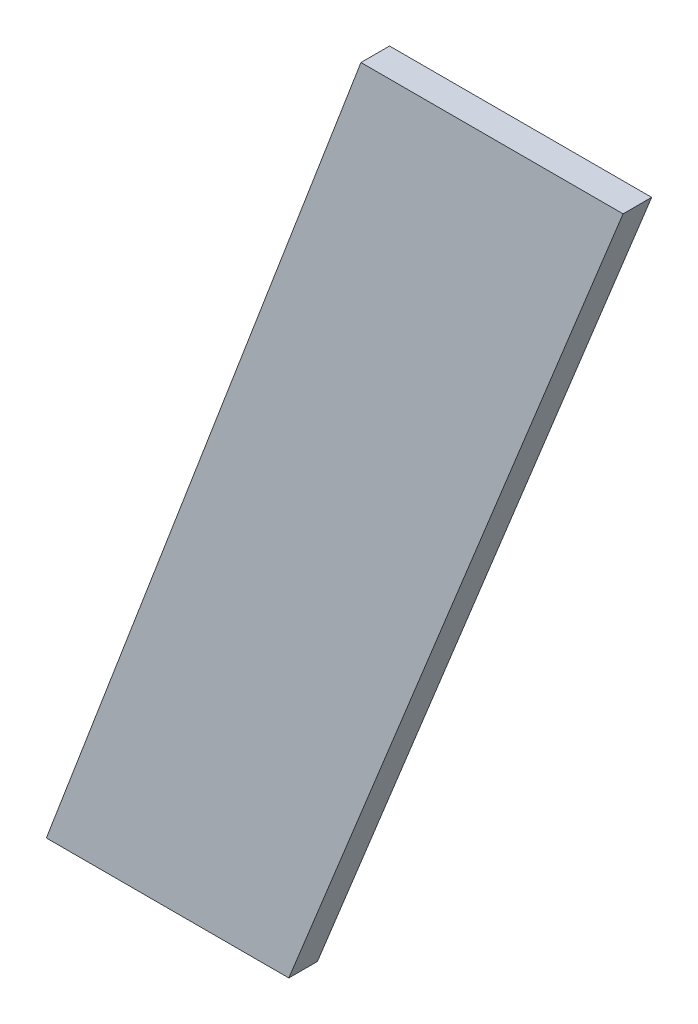
ISO-10303-21;
HEADER;
FILE_DESCRIPTION(('STEP AP214'),'2;1');
FILE_NAME('part.step','',(''),(''),'','','');
FILE_SCHEMA(('AUTOMOTIVE_DESIGN { 1 0 10303 214 1 1 1 1 }'));
ENDSEC;
DATA;
#1=APPLICATION_CONTEXT('core data for automotive mechanical design processes');
#2=APPLICATION_PROTOCOL_DEFINITION('international standard','automotive_design',2000,#1);
#3=PRODUCT_CONTEXT('',#1,'mechanical');
#4=PRODUCT('Part','Part','',(#3));
#5=PRODUCT_RELATED_PRODUCT_CATEGORY('part','',(#4));
#6=PRODUCT_DEFINITION_FORMATION('','',#4);
#7=PRODUCT_DEFINITION_CONTEXT('part definition',#1,'design');
#8=PRODUCT_DEFINITION('design','',#6,#7);
#9=PRODUCT_DEFINITION_SHAPE('','',#8);
#10=(LENGTH_UNIT() NAMED_UNIT(*) SI_UNIT(.MILLI.,.METRE.));
#11=(NAMED_UNIT(*) PLANE_ANGLE_UNIT() SI_UNIT($,.RADIAN.));
#12=(NAMED_UNIT(*) SI_UNIT($,.STERADIAN.) SOLID_ANGLE_UNIT());
#13=UNCERTAINTY_MEASURE_WITH_UNIT(LENGTH_MEASURE(1.E-05),#10,'distance_accuracy_value','');
#14=(GEOMETRIC_REPRESENTATION_CONTEXT(3) GLOBAL_UNCERTAINTY_ASSIGNED_CONTEXT((#13)) GLOBAL_UNIT_ASSIGNED_CONTEXT((#10,
#11,#12)) REPRESENTATION_CONTEXT('',''));
#15=CARTESIAN_POINT('',(0.,0.,0.));
#16=DIRECTION('',(0.,0.,1.));
#17=DIRECTION('',(1.,0.,0.));
#18=AXIS2_PLACEMENT_3D('',#15,#16,#17);
#19=CARTESIAN_POINT('',(14.2007211538462,15.,0.5));
#20=DIRECTION('',(0.,-1.,0.));
#21=DIRECTION('',(0.,0.,-1.));
#22=AXIS2_PLACEMENT_3D('',#19,#20,#21);
#23=PLANE('',#22);
#24=DIRECTION('',(-1.,0.,0.));
#25=VECTOR('',#24,1.);
#26=CARTESIAN_POINT('',(14.2007211538462,15.,0.));
#27=LINE('',#26,#25);
#28=CARTESIAN_POINT('',(14.2007211538462,15.,0.));
#29=VERTEX_POINT('',#28);
#30=CARTESIAN_POINT('',(9.61538461538463,15.,0.));
#31=VERTEX_POINT('',#30);
#32=EDGE_CURVE('E84',#29,#31,#27,.T.);
#33=ORIENTED_EDGE('',*,*,#32,.T.);
#34=DIRECTION('',(0.,0.,-1.));
#35=VECTOR('',#34,1.);
#36=CARTESIAN_POINT('',(9.61538461538463,15.,0.5));
#37=LINE('',#36,#35);
#38=CARTESIAN_POINT('',(9.61538461538463,15.,0.5));
#39=VERTEX_POINT('',#38);
#40=EDGE_CURVE('E90',#39,#31,#37,.T.);
#41=ORIENTED_EDGE('',*,*,#40,.F.);
#42=DIRECTION('',(-1.,0.,0.));
#43=VECTOR('',#42,1.);
#44=CARTESIAN_POINT('',(14.2007211538462,15.,0.5));
#45=LINE('',#44,#43);
#46=CARTESIAN_POINT('',(14.2007211538462,15.,0.5));
#47=VERTEX_POINT('',#46);
#48=EDGE_CURVE('E104',#47,#39,#45,.T.);
#49=ORIENTED_EDGE('',*,*,#48,.F.);
#50=DIRECTION('',(0.,0.,-1.));
#51=VECTOR('',#50,1.);
#52=CARTESIAN_POINT('',(14.2007211538462,15.,0.5));
#53=LINE('',#52,#51);
#54=EDGE_CURVE('E48',#47,#29,#53,.T.);
#55=ORIENTED_EDGE('',*,*,#54,.T.);
#56=EDGE_LOOP('',(#33,#41,#49,#55));
#57=FACE_BOUND('',#56,.T.);
#58=ADVANCED_FACE('F39',(#57),#23,.F.);
#59=CARTESIAN_POINT('',(0.579497032906944,-8.90680562357167,0.5));
#60=DIRECTION('',(0.,0.,-1.));
#61=DIRECTION('',(-1.,0.,0.));
#62=AXIS2_PLACEMENT_3D('',#59,#60,#61);
#63=PLANE('',#62);
#64=DIRECTION('',(-0.354843274387437,-0.934925799527429,0.));
#65=VECTOR('',#64,1.);
#66=CARTESIAN_POINT('',(9.61538461538463,15.,0.5));
#67=LINE('',#66,#65);
#68=CARTESIAN_POINT('',(4.11203078642991,0.5,0.5));
#69=VERTEX_POINT('',#68);
#70=EDGE_CURVE('E98',#39,#69,#67,.T.);
#71=ORIENTED_EDGE('',*,*,#70,.T.);
#72=DIRECTION('',(1.,0.,0.));
#73=VECTOR('',#72,1.);
#74=CARTESIAN_POINT('',(0.579497032906944,0.5,0.5));
#75=LINE('',#74,#73);
#76=CARTESIAN_POINT('',(8.35366586538463,0.5,0.5));
#77=VERTEX_POINT('',#76);
#78=EDGE_CURVE('E72',#69,#77,#75,.T.);
#79=ORIENTED_EDGE('',*,*,#78,.T.);
#80=DIRECTION('',(0.37398380014855,0.927435236135898,0.));
#81=VECTOR('',#80,1.);
#82=CARTESIAN_POINT('',(2.1033653846154,-15.,0.5));
#83=LINE('',#82,#81);
#84=EDGE_CURVE('E77',#77,#47,#83,.T.);
#85=ORIENTED_EDGE('',*,*,#84,.T.);
#86=ORIENTED_EDGE('',*,*,#48,.T.);
#87=EDGE_LOOP('',(#71,#79,#85,#86));
#88=FACE_BOUND('',#87,.T.);
#89=ADVANCED_FACE('F112',(#88),#63,.F.);
#90=CARTESIAN_POINT('',(9.61538461538463,15.,0.5));
#91=DIRECTION('',(0.934925799527429,-0.354843274387437,0.));
#92=DIRECTION('',(0.354843274387437,0.934925799527429,0.));
#93=AXIS2_PLACEMENT_3D('',#90,#91,#92);
#94=PLANE('',#93);
#95=DIRECTION('',(-0.354843274387437,-0.934925799527429,0.));
#96=VECTOR('',#95,1.);
#97=CARTESIAN_POINT('',(9.61538461538463,15.,0.));
#98=LINE('',#97,#96);
#99=CARTESIAN_POINT('',(4.11203078642991,0.5,0.));
#100=VERTEX_POINT('',#99);
#101=EDGE_CURVE('E95',#31,#100,#98,.T.);
#102=ORIENTED_EDGE('',*,*,#101,.T.);
#103=DIRECTION('',(0.,0.,1.));
#104=VECTOR('',#103,1.);
#105=CARTESIAN_POINT('',(4.11203078642991,0.5,0.5));
#106=LINE('',#105,#104);
#107=EDGE_CURVE('E67',#100,#69,#106,.T.);
#108=ORIENTED_EDGE('',*,*,#107,.T.);
#109=ORIENTED_EDGE('',*,*,#70,.F.);
#110=ORIENTED_EDGE('',*,*,#40,.T.);
#111=EDGE_LOOP('',(#102,#108,#109,#110));
#112=FACE_BOUND('',#111,.T.);
#113=ADVANCED_FACE('F100',(#112),#94,.F.);
#114=CARTESIAN_POINT('',(2.1033653846154,-15.,0.5));
#115=DIRECTION('',(-0.927435236135898,0.37398380014855,0.));
#116=DIRECTION('',(-0.37398380014855,-0.927435236135898,0.));
#117=AXIS2_PLACEMENT_3D('',#114,#115,#116);
#118=PLANE('',#117);
#119=ORIENTED_EDGE('',*,*,#84,.F.);
#120=DIRECTION('',(0.,0.,-1.));
#121=VECTOR('',#120,1.);
#122=CARTESIAN_POINT('',(8.35366586538463,0.5,0.5));
#123=LINE('',#122,#121);
#124=CARTESIAN_POINT('',(8.35366586538463,0.499999999999999,0.));
#125=VERTEX_POINT('',#124);
#126=EDGE_CURVE('E54',#77,#125,#123,.T.);
#127=ORIENTED_EDGE('',*,*,#126,.T.);
#128=DIRECTION('',(0.37398380014855,0.927435236135898,0.));
#129=VECTOR('',#128,1.);
#130=CARTESIAN_POINT('',(2.1033653846154,-15.,0.));
#131=LINE('',#130,#129);
#132=EDGE_CURVE('E93',#125,#29,#131,.T.);
#133=ORIENTED_EDGE('',*,*,#132,.T.);
#134=ORIENTED_EDGE('',*,*,#54,.F.);
#135=EDGE_LOOP('',(#119,#127,#133,#134));
#136=FACE_BOUND('',#135,.T.);
#137=ADVANCED_FACE('F41',(#136),#118,.F.);
#138=CARTESIAN_POINT('',(0.579497032906944,-8.90680562357167,0.));
#139=DIRECTION('',(0.,0.,-1.));
#140=DIRECTION('',(-1.,0.,0.));
#141=AXIS2_PLACEMENT_3D('',#138,#139,#140);
#142=PLANE('',#141);
#143=DIRECTION('',(1.,0.,0.));
#144=VECTOR('',#143,1.);
#145=CARTESIAN_POINT('',(0.579497032906944,0.5,0.));
#146=LINE('',#145,#144);
#147=EDGE_CURVE('E11',#100,#125,#146,.T.);
#148=ORIENTED_EDGE('',*,*,#147,.F.);
#149=ORIENTED_EDGE('',*,*,#101,.F.);
#150=ORIENTED_EDGE('',*,*,#32,.F.);
#151=ORIENTED_EDGE('',*,*,#132,.F.);
#152=EDGE_LOOP('',(#148,#149,#150,#151));
#153=FACE_BOUND('',#152,.T.);
#154=ADVANCED_FACE('F102',(#153),#142,.T.);
#155=CARTESIAN_POINT('',(-17.,0.5,1.));
#156=DIRECTION('',(0.,1.,0.));
#157=DIRECTION('',(0.,0.,1.));
#158=AXIS2_PLACEMENT_3D('',#155,#156,#157);
#159=PLANE('',#158);
#160=ORIENTED_EDGE('',*,*,#78,.F.);
#161=ORIENTED_EDGE('',*,*,#107,.F.);
#162=ORIENTED_EDGE('',*,*,#147,.T.);
#163=ORIENTED_EDGE('',*,*,#126,.F.);
#164=EDGE_LOOP('',(#160,#161,#162,#163));
#165=FACE_BOUND('',#164,.T.);
#166=ADVANCED_FACE('F118',(#165),#159,.F.);
#167=CLOSED_SHELL('',(#58,#89,#113,#137,#154,#166));
#168=MANIFOLD_SOLID_BREP('B2',#167);
#169=ADVANCED_BREP_SHAPE_REPRESENTATION('',(#18,#168),#14);
#170=SHAPE_DEFINITION_REPRESENTATION(#9,#169);
ENDSEC;
END-ISO-10303-21;
